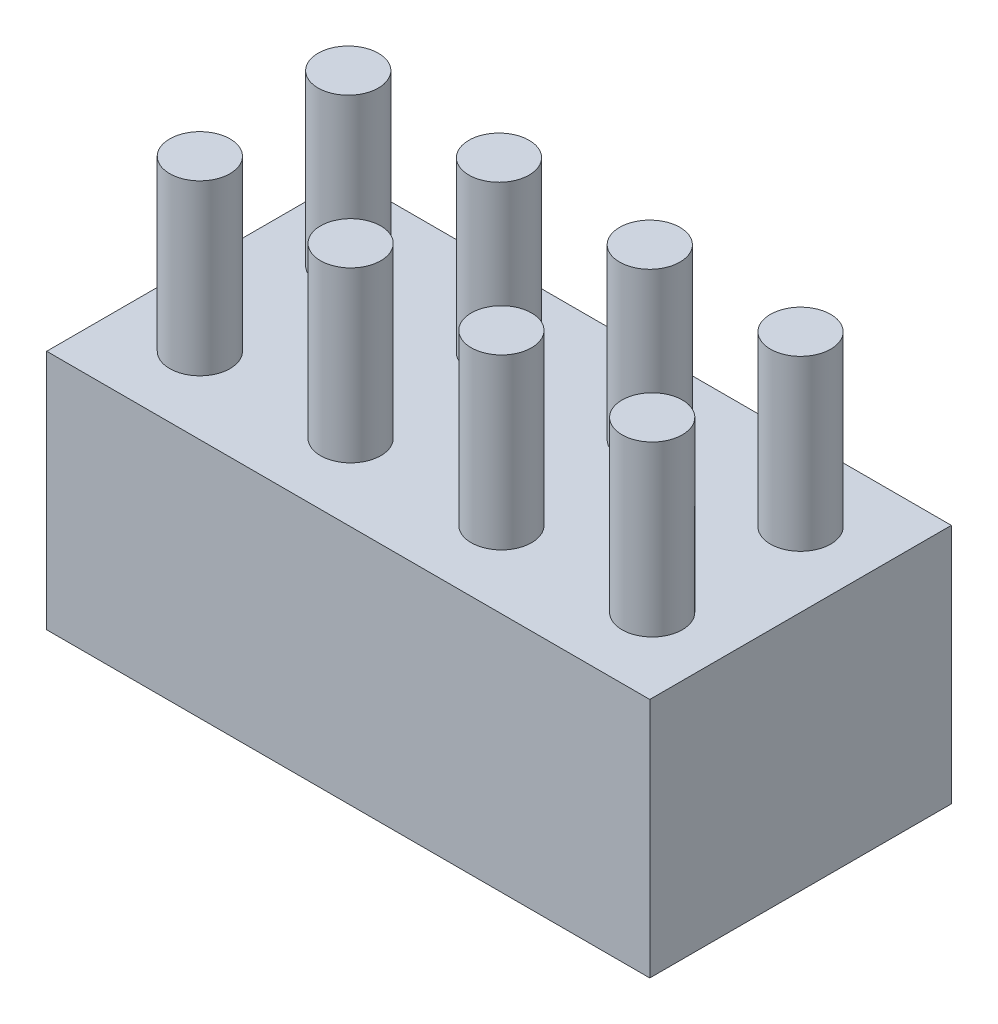
ISO-10303-21;
HEADER;
FILE_DESCRIPTION(('STEP AP214'),'2;1');
FILE_NAME('part.step','',(''),(''),'','','');
FILE_SCHEMA(('AUTOMOTIVE_DESIGN { 1 0 10303 214 1 1 1 1 }'));
ENDSEC;
DATA;
#1=APPLICATION_CONTEXT('core data for automotive mechanical design processes');
#2=APPLICATION_PROTOCOL_DEFINITION('international standard','automotive_design',2000,#1);
#3=PRODUCT_CONTEXT('',#1,'mechanical');
#4=PRODUCT('Part','Part','',(#3));
#5=PRODUCT_RELATED_PRODUCT_CATEGORY('part','',(#4));
#6=PRODUCT_DEFINITION_FORMATION('','',#4);
#7=PRODUCT_DEFINITION_CONTEXT('part definition',#1,'design');
#8=PRODUCT_DEFINITION('design','',#6,#7);
#9=PRODUCT_DEFINITION_SHAPE('','',#8);
#10=(LENGTH_UNIT() NAMED_UNIT(*) SI_UNIT(.MILLI.,.METRE.));
#11=(NAMED_UNIT(*) PLANE_ANGLE_UNIT() SI_UNIT($,.RADIAN.));
#12=(NAMED_UNIT(*) SI_UNIT($,.STERADIAN.) SOLID_ANGLE_UNIT());
#13=UNCERTAINTY_MEASURE_WITH_UNIT(LENGTH_MEASURE(1.E-05),#10,'distance_accuracy_value','');
#14=(GEOMETRIC_REPRESENTATION_CONTEXT(3) GLOBAL_UNCERTAINTY_ASSIGNED_CONTEXT((#13)) GLOBAL_UNIT_ASSIGNED_CONTEXT((#10,
#11,#12)) REPRESENTATION_CONTEXT('',''));
#15=CARTESIAN_POINT('',(0.,0.,0.));
#16=DIRECTION('',(0.,0.,1.));
#17=DIRECTION('',(1.,0.,0.));
#18=AXIS2_PLACEMENT_3D('',#15,#16,#17);
#19=CARTESIAN_POINT('',(3.77,57.2,-3.73));
#20=DIRECTION('',(0.,1.,0.));
#21=DIRECTION('',(1.,0.,0.));
#22=AXIS2_PLACEMENT_3D('',#19,#20,#21);
#23=PLANE('',#22);
#24=CARTESIAN_POINT('',(3.77,57.2,-3.73));
#25=DIRECTION('',(0.,1.,0.));
#26=DIRECTION('',(0.,0.,1.));
#27=AXIS2_PLACEMENT_3D('',#24,#25,#26);
#28=CIRCLE('',#27,0.5);
#29=CARTESIAN_POINT('',(3.77,57.2,-4.23));
#30=VERTEX_POINT('',#29);
#31=EDGE_CURVE('E169',#30,#30,#28,.T.);
#32=ORIENTED_EDGE('',*,*,#31,.T.);
#33=EDGE_LOOP('',(#32));
#34=FACE_BOUND('',#33,.T.);
#35=ADVANCED_FACE('F16',(#34),#23,.T.);
#36=CARTESIAN_POINT('',(1.27,57.2,-3.73));
#37=DIRECTION('',(0.,1.,0.));
#38=DIRECTION('',(1.,0.,0.));
#39=AXIS2_PLACEMENT_3D('',#36,#37,#38);
#40=PLANE('',#39);
#41=CARTESIAN_POINT('',(1.27,57.2,-3.73));
#42=DIRECTION('',(0.,1.,0.));
#43=DIRECTION('',(0.,0.,1.));
#44=AXIS2_PLACEMENT_3D('',#41,#42,#43);
#45=CIRCLE('',#44,0.5);
#46=CARTESIAN_POINT('',(1.27,57.2,-4.23));
#47=VERTEX_POINT('',#46);
#48=EDGE_CURVE('E153',#47,#47,#45,.T.);
#49=ORIENTED_EDGE('',*,*,#48,.T.);
#50=EDGE_LOOP('',(#49));
#51=FACE_BOUND('',#50,.T.);
#52=ADVANCED_FACE('F249',(#51),#40,.T.);
#53=CARTESIAN_POINT('',(-1.23,57.2,-3.73));
#54=DIRECTION('',(0.,1.,0.));
#55=DIRECTION('',(1.,0.,0.));
#56=AXIS2_PLACEMENT_3D('',#53,#54,#55);
#57=PLANE('',#56);
#58=CARTESIAN_POINT('',(-1.23,57.2,-3.73));
#59=DIRECTION('',(0.,1.,0.));
#60=DIRECTION('',(0.,0.,1.));
#61=AXIS2_PLACEMENT_3D('',#58,#59,#60);
#62=CIRCLE('',#61,0.5);
#63=CARTESIAN_POINT('',(-1.23,57.2,-4.23));
#64=VERTEX_POINT('',#63);
#65=EDGE_CURVE('E161',#64,#64,#62,.T.);
#66=ORIENTED_EDGE('',*,*,#65,.T.);
#67=EDGE_LOOP('',(#66));
#68=FACE_BOUND('',#67,.T.);
#69=ADVANCED_FACE('F254',(#68),#57,.T.);
#70=CARTESIAN_POINT('',(3.77,57.2,-1.27));
#71=DIRECTION('',(0.,1.,0.));
#72=DIRECTION('',(1.,0.,0.));
#73=AXIS2_PLACEMENT_3D('',#70,#71,#72);
#74=PLANE('',#73);
#75=CARTESIAN_POINT('',(3.77,57.2,-1.27));
#76=DIRECTION('',(0.,1.,0.));
#77=DIRECTION('',(0.,0.,1.));
#78=AXIS2_PLACEMENT_3D('',#75,#76,#77);
#79=CIRCLE('',#78,0.5);
#80=CARTESIAN_POINT('',(3.77,57.2,-1.77));
#81=VERTEX_POINT('',#80);
#82=EDGE_CURVE('E197',#81,#81,#79,.T.);
#83=ORIENTED_EDGE('',*,*,#82,.T.);
#84=EDGE_LOOP('',(#83));
#85=FACE_BOUND('',#84,.T.);
#86=ADVANCED_FACE('F267',(#85),#74,.T.);
#87=CARTESIAN_POINT('',(1.27,57.2,-1.27));
#88=DIRECTION('',(0.,1.,0.));
#89=DIRECTION('',(1.,0.,0.));
#90=AXIS2_PLACEMENT_3D('',#87,#88,#89);
#91=PLANE('',#90);
#92=CARTESIAN_POINT('',(1.27,57.2,-1.27));
#93=DIRECTION('',(0.,1.,0.));
#94=DIRECTION('',(0.,0.,1.));
#95=AXIS2_PLACEMENT_3D('',#92,#93,#94);
#96=CIRCLE('',#95,0.5);
#97=CARTESIAN_POINT('',(1.27,57.2,-1.77));
#98=VERTEX_POINT('',#97);
#99=EDGE_CURVE('E183',#98,#98,#96,.T.);
#100=ORIENTED_EDGE('',*,*,#99,.T.);
#101=EDGE_LOOP('',(#100));
#102=FACE_BOUND('',#101,.T.);
#103=ADVANCED_FACE('F264',(#102),#91,.T.);
#104=CARTESIAN_POINT('',(-1.23,57.2,-1.27));
#105=DIRECTION('',(0.,1.,0.));
#106=DIRECTION('',(1.,0.,0.));
#107=AXIS2_PLACEMENT_3D('',#104,#105,#106);
#108=PLANE('',#107);
#109=CARTESIAN_POINT('',(-1.23,57.2,-1.27));
#110=DIRECTION('',(0.,1.,0.));
#111=DIRECTION('',(0.,0.,1.));
#112=AXIS2_PLACEMENT_3D('',#109,#110,#111);
#113=CIRCLE('',#112,0.5);
#114=CARTESIAN_POINT('',(-1.23,57.2,-1.77));
#115=VERTEX_POINT('',#114);
#116=EDGE_CURVE('E158',#115,#115,#113,.T.);
#117=ORIENTED_EDGE('',*,*,#116,.T.);
#118=EDGE_LOOP('',(#117));
#119=FACE_BOUND('',#118,.T.);
#120=ADVANCED_FACE('F266',(#119),#108,.T.);
#121=CARTESIAN_POINT('',(-3.73,57.2,-1.27));
#122=DIRECTION('',(0.,1.,0.));
#123=DIRECTION('',(1.,0.,0.));
#124=AXIS2_PLACEMENT_3D('',#121,#122,#123);
#125=PLANE('',#124);
#126=CARTESIAN_POINT('',(-3.73,57.2,-1.27));
#127=DIRECTION('',(0.,1.,0.));
#128=DIRECTION('',(0.,0.,1.));
#129=AXIS2_PLACEMENT_3D('',#126,#127,#128);
#130=CIRCLE('',#129,0.5);
#131=CARTESIAN_POINT('',(-3.73,57.2,-1.77));
#132=VERTEX_POINT('',#131);
#133=EDGE_CURVE('E157',#132,#132,#130,.T.);
#134=ORIENTED_EDGE('',*,*,#133,.T.);
#135=EDGE_LOOP('',(#134));
#136=FACE_BOUND('',#135,.T.);
#137=ADVANCED_FACE('F273',(#136),#125,.T.);
#138=CARTESIAN_POINT('',(-3.73,57.2,-3.73));
#139=DIRECTION('',(0.,1.,0.));
#140=DIRECTION('',(1.,0.,0.));
#141=AXIS2_PLACEMENT_3D('',#138,#139,#140);
#142=PLANE('',#141);
#143=CARTESIAN_POINT('',(-3.73,57.2,-3.73));
#144=DIRECTION('',(0.,1.,0.));
#145=DIRECTION('',(0.,0.,1.));
#146=AXIS2_PLACEMENT_3D('',#143,#144,#145);
#147=CIRCLE('',#146,0.5);
#148=CARTESIAN_POINT('',(-3.73,57.2,-4.23));
#149=VERTEX_POINT('',#148);
#150=EDGE_CURVE('E149',#149,#149,#147,.T.);
#151=ORIENTED_EDGE('',*,*,#150,.T.);
#152=EDGE_LOOP('',(#151));
#153=FACE_BOUND('',#152,.T.);
#154=ADVANCED_FACE('F262',(#153),#142,.T.);
#155=CARTESIAN_POINT('',(0.,54.4,0.));
#156=DIRECTION('',(0.,1.,0.));
#157=DIRECTION('',(1.,0.,0.));
#158=AXIS2_PLACEMENT_3D('',#155,#156,#157);
#159=PLANE('',#158);
#160=CARTESIAN_POINT('',(-3.73,54.4,-3.73));
#161=DIRECTION('',(0.,1.,0.));
#162=DIRECTION('',(0.,0.,1.));
#163=AXIS2_PLACEMENT_3D('',#160,#161,#162);
#164=CIRCLE('',#163,0.5);
#165=CARTESIAN_POINT('',(-3.73,54.4,-4.23));
#166=VERTEX_POINT('',#165);
#167=EDGE_CURVE('E140',#166,#166,#164,.T.);
#168=ORIENTED_EDGE('',*,*,#167,.F.);
#169=EDGE_LOOP('',(#168));
#170=FACE_BOUND('',#169,.T.);
#171=CARTESIAN_POINT('',(-3.73,54.4,-1.27));
#172=DIRECTION('',(0.,1.,0.));
#173=DIRECTION('',(0.,0.,1.));
#174=AXIS2_PLACEMENT_3D('',#171,#172,#173);
#175=CIRCLE('',#174,0.5);
#176=CARTESIAN_POINT('',(-3.73,54.4,-1.77));
#177=VERTEX_POINT('',#176);
#178=EDGE_CURVE('E163',#177,#177,#175,.T.);
#179=ORIENTED_EDGE('',*,*,#178,.F.);
#180=EDGE_LOOP('',(#179));
#181=FACE_BOUND('',#180,.T.);
#182=CARTESIAN_POINT('',(-1.23,54.4,-1.27));
#183=DIRECTION('',(0.,1.,0.));
#184=DIRECTION('',(0.,0.,1.));
#185=AXIS2_PLACEMENT_3D('',#182,#183,#184);
#186=CIRCLE('',#185,0.5);
#187=CARTESIAN_POINT('',(-1.23,54.4,-1.77));
#188=VERTEX_POINT('',#187);
#189=EDGE_CURVE('E155',#188,#188,#186,.T.);
#190=ORIENTED_EDGE('',*,*,#189,.F.);
#191=EDGE_LOOP('',(#190));
#192=FACE_BOUND('',#191,.T.);
#193=CARTESIAN_POINT('',(1.27,54.4,-1.27));
#194=DIRECTION('',(0.,1.,0.));
#195=DIRECTION('',(0.,0.,1.));
#196=AXIS2_PLACEMENT_3D('',#193,#194,#195);
#197=CIRCLE('',#196,0.5);
#198=CARTESIAN_POINT('',(1.27,54.4,-1.77));
#199=VERTEX_POINT('',#198);
#200=EDGE_CURVE('E185',#199,#199,#197,.T.);
#201=ORIENTED_EDGE('',*,*,#200,.F.);
#202=EDGE_LOOP('',(#201));
#203=FACE_BOUND('',#202,.T.);
#204=CARTESIAN_POINT('',(3.77,54.4,-1.27));
#205=DIRECTION('',(0.,1.,0.));
#206=DIRECTION('',(0.,0.,1.));
#207=AXIS2_PLACEMENT_3D('',#204,#205,#206);
#208=CIRCLE('',#207,0.5);
#209=CARTESIAN_POINT('',(3.77,54.4,-1.77));
#210=VERTEX_POINT('',#209);
#211=EDGE_CURVE('E186',#210,#210,#208,.T.);
#212=ORIENTED_EDGE('',*,*,#211,.F.);
#213=EDGE_LOOP('',(#212));
#214=FACE_BOUND('',#213,.T.);
#215=CARTESIAN_POINT('',(-1.23,54.4,-3.73));
#216=DIRECTION('',(0.,1.,0.));
#217=DIRECTION('',(0.,0.,1.));
#218=AXIS2_PLACEMENT_3D('',#215,#216,#217);
#219=CIRCLE('',#218,0.5);
#220=CARTESIAN_POINT('',(-1.23,54.4,-4.23));
#221=VERTEX_POINT('',#220);
#222=EDGE_CURVE('E178',#221,#221,#219,.T.);
#223=ORIENTED_EDGE('',*,*,#222,.F.);
#224=EDGE_LOOP('',(#223));
#225=FACE_BOUND('',#224,.T.);
#226=CARTESIAN_POINT('',(1.27,54.4,-3.73));
#227=DIRECTION('',(0.,1.,0.));
#228=DIRECTION('',(0.,0.,1.));
#229=AXIS2_PLACEMENT_3D('',#226,#227,#228);
#230=CIRCLE('',#229,0.5);
#231=CARTESIAN_POINT('',(1.27,54.4,-4.23));
#232=VERTEX_POINT('',#231);
#233=EDGE_CURVE('E159',#232,#232,#230,.T.);
#234=ORIENTED_EDGE('',*,*,#233,.F.);
#235=EDGE_LOOP('',(#234));
#236=FACE_BOUND('',#235,.T.);
#237=CARTESIAN_POINT('',(3.77,54.4,-3.73));
#238=DIRECTION('',(0.,1.,0.));
#239=DIRECTION('',(0.,0.,1.));
#240=AXIS2_PLACEMENT_3D('',#237,#238,#239);
#241=CIRCLE('',#240,0.5);
#242=CARTESIAN_POINT('',(3.77,54.4,-4.23));
#243=VERTEX_POINT('',#242);
#244=EDGE_CURVE('E166',#243,#243,#241,.T.);
#245=ORIENTED_EDGE('',*,*,#244,.F.);
#246=EDGE_LOOP('',(#245));
#247=FACE_BOUND('',#246,.T.);
#248=DIRECTION('',(0.,0.,1.));
#249=VECTOR('',#248,1.);
#250=CARTESIAN_POINT('',(-5.,54.4,-5.));
#251=LINE('',#250,#249);
#252=CARTESIAN_POINT('',(-5.,54.4,-5.));
#253=VERTEX_POINT('',#252);
#254=CARTESIAN_POINT('',(-5.,54.4,0.));
#255=VERTEX_POINT('',#254);
#256=EDGE_CURVE('E129',#253,#255,#251,.T.);
#257=ORIENTED_EDGE('',*,*,#256,.T.);
#258=DIRECTION('',(1.,0.,0.));
#259=VECTOR('',#258,1.);
#260=CARTESIAN_POINT('',(-5.,54.4,0.));
#261=LINE('',#260,#259);
#262=CARTESIAN_POINT('',(5.,54.4,0.));
#263=VERTEX_POINT('',#262);
#264=EDGE_CURVE('E27',#255,#263,#261,.T.);
#265=ORIENTED_EDGE('',*,*,#264,.T.);
#266=DIRECTION('',(0.,0.,-1.));
#267=VECTOR('',#266,1.);
#268=CARTESIAN_POINT('',(5.,54.4,-5.));
#269=LINE('',#268,#267);
#270=CARTESIAN_POINT('',(5.,54.4,-5.));
#271=VERTEX_POINT('',#270);
#272=EDGE_CURVE('E173',#263,#271,#269,.T.);
#273=ORIENTED_EDGE('',*,*,#272,.T.);
#274=DIRECTION('',(-1.,0.,0.));
#275=VECTOR('',#274,1.);
#276=CARTESIAN_POINT('',(-5.,54.4,-5.));
#277=LINE('',#276,#275);
#278=EDGE_CURVE('E133',#271,#253,#277,.T.);
#279=ORIENTED_EDGE('',*,*,#278,.T.);
#280=EDGE_LOOP('',(#257,#265,#273,#279));
#281=FACE_BOUND('',#280,.T.);
#282=ADVANCED_FACE('F135',(#170,#181,#192,#203,#214,#225,#236,#247,#281),#159,.T.);
#283=CARTESIAN_POINT('',(0.,50.4,0.));
#284=DIRECTION('',(0.,1.,0.));
#285=DIRECTION('',(1.,0.,0.));
#286=AXIS2_PLACEMENT_3D('',#283,#284,#285);
#287=PLANE('',#286);
#288=DIRECTION('',(0.,0.,1.));
#289=VECTOR('',#288,1.);
#290=CARTESIAN_POINT('',(-5.,50.4,-5.));
#291=LINE('',#290,#289);
#292=CARTESIAN_POINT('',(-5.,50.4,-5.));
#293=VERTEX_POINT('',#292);
#294=CARTESIAN_POINT('',(-5.,50.4,0.));
#295=VERTEX_POINT('',#294);
#296=EDGE_CURVE('E131',#293,#295,#291,.T.);
#297=ORIENTED_EDGE('',*,*,#296,.F.);
#298=DIRECTION('',(-1.,0.,0.));
#299=VECTOR('',#298,1.);
#300=CARTESIAN_POINT('',(-5.,50.4,-5.));
#301=LINE('',#300,#299);
#302=CARTESIAN_POINT('',(5.,50.4,-5.));
#303=VERTEX_POINT('',#302);
#304=EDGE_CURVE('E20',#303,#293,#301,.T.);
#305=ORIENTED_EDGE('',*,*,#304,.F.);
#306=DIRECTION('',(0.,0.,-1.));
#307=VECTOR('',#306,1.);
#308=CARTESIAN_POINT('',(5.,50.4,-5.));
#309=LINE('',#308,#307);
#310=CARTESIAN_POINT('',(5.,50.4,0.));
#311=VERTEX_POINT('',#310);
#312=EDGE_CURVE('E123',#311,#303,#309,.T.);
#313=ORIENTED_EDGE('',*,*,#312,.F.);
#314=DIRECTION('',(1.,0.,0.));
#315=VECTOR('',#314,1.);
#316=CARTESIAN_POINT('',(-5.,50.4,0.));
#317=LINE('',#316,#315);
#318=EDGE_CURVE('E11',#295,#311,#317,.T.);
#319=ORIENTED_EDGE('',*,*,#318,.F.);
#320=EDGE_LOOP('',(#297,#305,#313,#319));
#321=FACE_BOUND('',#320,.T.);
#322=ADVANCED_FACE('F207',(#321),#287,.F.);
#323=CARTESIAN_POINT('',(-5.,50.4,0.));
#324=DIRECTION('',(0.,0.,1.));
#325=DIRECTION('',(1.,0.,0.));
#326=AXIS2_PLACEMENT_3D('',#323,#324,#325);
#327=PLANE('',#326);
#328=ORIENTED_EDGE('',*,*,#264,.F.);
#329=DIRECTION('',(0.,1.,0.));
#330=VECTOR('',#329,1.);
#331=CARTESIAN_POINT('',(-5.,50.4,0.));
#332=LINE('',#331,#330);
#333=EDGE_CURVE('E115',#295,#255,#332,.T.);
#334=ORIENTED_EDGE('',*,*,#333,.F.);
#335=ORIENTED_EDGE('',*,*,#318,.T.);
#336=DIRECTION('',(0.,1.,0.));
#337=VECTOR('',#336,1.);
#338=CARTESIAN_POINT('',(5.,50.4,0.));
#339=LINE('',#338,#337);
#340=EDGE_CURVE('E118',#311,#263,#339,.T.);
#341=ORIENTED_EDGE('',*,*,#340,.T.);
#342=EDGE_LOOP('',(#328,#334,#335,#341));
#343=FACE_BOUND('',#342,.T.);
#344=ADVANCED_FACE('F114',(#343),#327,.T.);
#345=CARTESIAN_POINT('',(5.,50.4,-5.));
#346=DIRECTION('',(1.,0.,0.));
#347=DIRECTION('',(0.,0.,1.));
#348=AXIS2_PLACEMENT_3D('',#345,#346,#347);
#349=PLANE('',#348);
#350=ORIENTED_EDGE('',*,*,#272,.F.);
#351=ORIENTED_EDGE('',*,*,#340,.F.);
#352=ORIENTED_EDGE('',*,*,#312,.T.);
#353=DIRECTION('',(0.,1.,0.));
#354=VECTOR('',#353,1.);
#355=CARTESIAN_POINT('',(5.,50.4,-5.));
#356=LINE('',#355,#354);
#357=EDGE_CURVE('E179',#303,#271,#356,.T.);
#358=ORIENTED_EDGE('',*,*,#357,.T.);
#359=EDGE_LOOP('',(#350,#351,#352,#358));
#360=FACE_BOUND('',#359,.T.);
#361=ADVANCED_FACE('F204',(#360),#349,.T.);
#362=CARTESIAN_POINT('',(-5.,50.4,-5.));
#363=DIRECTION('',(0.,0.,-1.));
#364=DIRECTION('',(0.,-1.,0.));
#365=AXIS2_PLACEMENT_3D('',#362,#363,#364);
#366=PLANE('',#365);
#367=ORIENTED_EDGE('',*,*,#278,.F.);
#368=ORIENTED_EDGE('',*,*,#357,.F.);
#369=ORIENTED_EDGE('',*,*,#304,.T.);
#370=DIRECTION('',(0.,1.,0.));
#371=VECTOR('',#370,1.);
#372=CARTESIAN_POINT('',(-5.,50.4,-5.));
#373=LINE('',#372,#371);
#374=EDGE_CURVE('E139',#293,#253,#373,.T.);
#375=ORIENTED_EDGE('',*,*,#374,.T.);
#376=EDGE_LOOP('',(#367,#368,#369,#375));
#377=FACE_BOUND('',#376,.T.);
#378=ADVANCED_FACE('F210',(#377),#366,.T.);
#379=CARTESIAN_POINT('',(-5.,50.4,-5.));
#380=DIRECTION('',(-1.,0.,0.));
#381=DIRECTION('',(0.,0.,1.));
#382=AXIS2_PLACEMENT_3D('',#379,#380,#381);
#383=PLANE('',#382);
#384=ORIENTED_EDGE('',*,*,#256,.F.);
#385=ORIENTED_EDGE('',*,*,#374,.F.);
#386=ORIENTED_EDGE('',*,*,#296,.T.);
#387=ORIENTED_EDGE('',*,*,#333,.T.);
#388=EDGE_LOOP('',(#384,#385,#386,#387));
#389=FACE_BOUND('',#388,.T.);
#390=ADVANCED_FACE('F127',(#389),#383,.T.);
#391=CARTESIAN_POINT('',(-3.73,57.2,-3.73));
#392=DIRECTION('',(0.,-1.,0.));
#393=DIRECTION('',(0.,0.,-1.));
#394=AXIS2_PLACEMENT_3D('',#391,#392,#393);
#395=CYLINDRICAL_SURFACE('',#394,0.5);
#396=ORIENTED_EDGE('',*,*,#167,.T.);
#397=EDGE_LOOP('',(#396));
#398=FACE_BOUND('',#397,.T.);
#399=ORIENTED_EDGE('',*,*,#150,.F.);
#400=EDGE_LOOP('',(#399));
#401=FACE_BOUND('',#400,.T.);
#402=ADVANCED_FACE('F259',(#398,#401),#395,.T.);
#403=CARTESIAN_POINT('',(-3.73,57.2,-1.27));
#404=DIRECTION('',(0.,-1.,0.));
#405=DIRECTION('',(0.,0.,-1.));
#406=AXIS2_PLACEMENT_3D('',#403,#404,#405);
#407=CYLINDRICAL_SURFACE('',#406,0.5);
#408=ORIENTED_EDGE('',*,*,#178,.T.);
#409=EDGE_LOOP('',(#408));
#410=FACE_BOUND('',#409,.T.);
#411=ORIENTED_EDGE('',*,*,#133,.F.);
#412=EDGE_LOOP('',(#411));
#413=FACE_BOUND('',#412,.T.);
#414=ADVANCED_FACE('F289',(#410,#413),#407,.T.);
#415=CARTESIAN_POINT('',(-1.23,57.2,-1.27));
#416=DIRECTION('',(0.,-1.,0.));
#417=DIRECTION('',(0.,0.,-1.));
#418=AXIS2_PLACEMENT_3D('',#415,#416,#417);
#419=CYLINDRICAL_SURFACE('',#418,0.5);
#420=ORIENTED_EDGE('',*,*,#189,.T.);
#421=EDGE_LOOP('',(#420));
#422=FACE_BOUND('',#421,.T.);
#423=ORIENTED_EDGE('',*,*,#116,.F.);
#424=EDGE_LOOP('',(#423));
#425=FACE_BOUND('',#424,.T.);
#426=ADVANCED_FACE('F281',(#422,#425),#419,.T.);
#427=CARTESIAN_POINT('',(1.27,57.2,-1.27));
#428=DIRECTION('',(0.,-1.,0.));
#429=DIRECTION('',(0.,0.,-1.));
#430=AXIS2_PLACEMENT_3D('',#427,#428,#429);
#431=CYLINDRICAL_SURFACE('',#430,0.5);
#432=ORIENTED_EDGE('',*,*,#200,.T.);
#433=EDGE_LOOP('',(#432));
#434=FACE_BOUND('',#433,.T.);
#435=ORIENTED_EDGE('',*,*,#99,.F.);
#436=EDGE_LOOP('',(#435));
#437=FACE_BOUND('',#436,.T.);
#438=ADVANCED_FACE('F18',(#434,#437),#431,.T.);
#439=CARTESIAN_POINT('',(3.77,57.2,-1.27));
#440=DIRECTION('',(0.,-1.,0.));
#441=DIRECTION('',(0.,0.,-1.));
#442=AXIS2_PLACEMENT_3D('',#439,#440,#441);
#443=CYLINDRICAL_SURFACE('',#442,0.5);
#444=ORIENTED_EDGE('',*,*,#211,.T.);
#445=EDGE_LOOP('',(#444));
#446=FACE_BOUND('',#445,.T.);
#447=ORIENTED_EDGE('',*,*,#82,.F.);
#448=EDGE_LOOP('',(#447));
#449=FACE_BOUND('',#448,.T.);
#450=ADVANCED_FACE('F280',(#446,#449),#443,.T.);
#451=CARTESIAN_POINT('',(-1.23,57.2,-3.73));
#452=DIRECTION('',(0.,-1.,0.));
#453=DIRECTION('',(0.,0.,-1.));
#454=AXIS2_PLACEMENT_3D('',#451,#452,#453);
#455=CYLINDRICAL_SURFACE('',#454,0.5);
#456=ORIENTED_EDGE('',*,*,#222,.T.);
#457=EDGE_LOOP('',(#456));
#458=FACE_BOUND('',#457,.T.);
#459=ORIENTED_EDGE('',*,*,#65,.F.);
#460=EDGE_LOOP('',(#459));
#461=FACE_BOUND('',#460,.T.);
#462=ADVANCED_FACE('F243',(#458,#461),#455,.T.);
#463=CARTESIAN_POINT('',(1.27,57.2,-3.73));
#464=DIRECTION('',(0.,-1.,0.));
#465=DIRECTION('',(0.,0.,-1.));
#466=AXIS2_PLACEMENT_3D('',#463,#464,#465);
#467=CYLINDRICAL_SURFACE('',#466,0.5);
#468=ORIENTED_EDGE('',*,*,#233,.T.);
#469=EDGE_LOOP('',(#468));
#470=FACE_BOUND('',#469,.T.);
#471=ORIENTED_EDGE('',*,*,#48,.F.);
#472=EDGE_LOOP('',(#471));
#473=FACE_BOUND('',#472,.T.);
#474=ADVANCED_FACE('F236',(#470,#473),#467,.T.);
#475=CARTESIAN_POINT('',(3.77,57.2,-3.73));
#476=DIRECTION('',(0.,-1.,0.));
#477=DIRECTION('',(0.,0.,-1.));
#478=AXIS2_PLACEMENT_3D('',#475,#476,#477);
#479=CYLINDRICAL_SURFACE('',#478,0.5);
#480=ORIENTED_EDGE('',*,*,#244,.T.);
#481=EDGE_LOOP('',(#480));
#482=FACE_BOUND('',#481,.T.);
#483=ORIENTED_EDGE('',*,*,#31,.F.);
#484=EDGE_LOOP('',(#483));
#485=FACE_BOUND('',#484,.T.);
#486=ADVANCED_FACE('F234',(#482,#485),#479,.T.);
#487=CLOSED_SHELL('',(#35,#52,#69,#86,#103,#120,#137,#154,#282,#322,#344,#361,#378,#390,#402,
#414,#426,#438,#450,#462,#474,#486));
#488=MANIFOLD_SOLID_BREP('B1',#487);
#489=ADVANCED_BREP_SHAPE_REPRESENTATION('',(#18,#488),#14);
#490=SHAPE_DEFINITION_REPRESENTATION(#9,#489);
ENDSEC;
END-ISO-10303-21;
